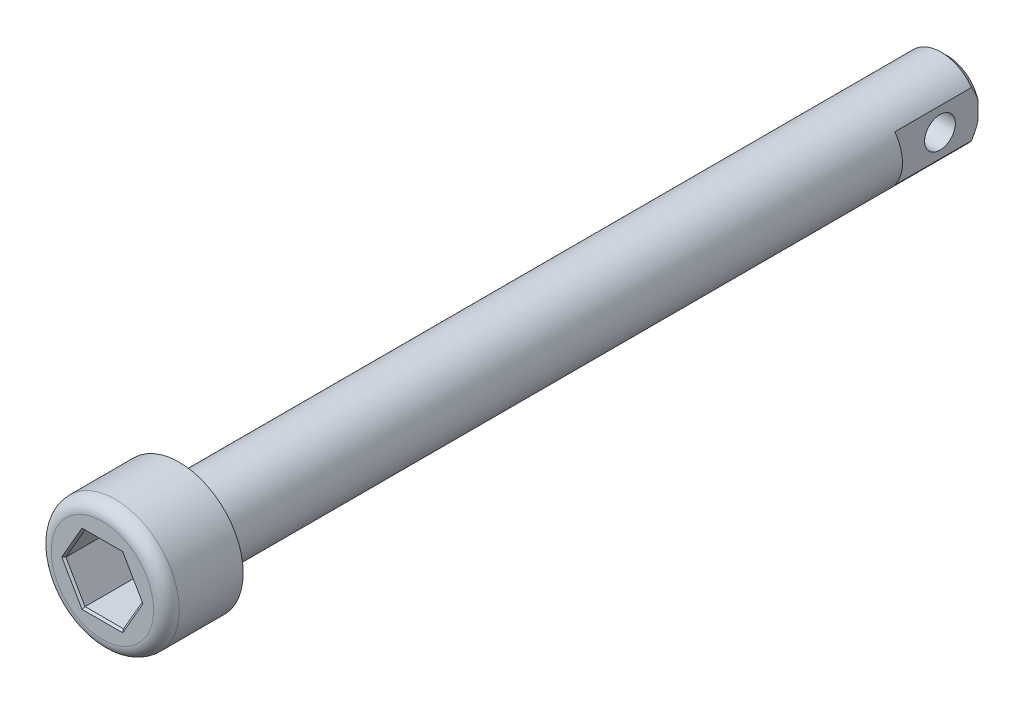
ISO-10303-21;
HEADER;
FILE_DESCRIPTION(('STEP AP214'),'2;1');
FILE_NAME('part.step','',(''),(''),'','','');
FILE_SCHEMA(('AUTOMOTIVE_DESIGN { 1 0 10303 214 1 1 1 1 }'));
ENDSEC;
DATA;
#1=APPLICATION_CONTEXT('core data for automotive mechanical design processes');
#2=APPLICATION_PROTOCOL_DEFINITION('international standard','automotive_design',2000,#1);
#3=PRODUCT_CONTEXT('',#1,'mechanical');
#4=PRODUCT('Part','Part','',(#3));
#5=PRODUCT_RELATED_PRODUCT_CATEGORY('part','',(#4));
#6=PRODUCT_DEFINITION_FORMATION('','',#4);
#7=PRODUCT_DEFINITION_CONTEXT('part definition',#1,'design');
#8=PRODUCT_DEFINITION('design','',#6,#7);
#9=PRODUCT_DEFINITION_SHAPE('','',#8);
#10=(LENGTH_UNIT() NAMED_UNIT(*) SI_UNIT(.MILLI.,.METRE.));
#11=(NAMED_UNIT(*) PLANE_ANGLE_UNIT() SI_UNIT($,.RADIAN.));
#12=(NAMED_UNIT(*) SI_UNIT($,.STERADIAN.) SOLID_ANGLE_UNIT());
#13=UNCERTAINTY_MEASURE_WITH_UNIT(LENGTH_MEASURE(1.E-05),#10,'distance_accuracy_value','');
#14=(GEOMETRIC_REPRESENTATION_CONTEXT(3) GLOBAL_UNCERTAINTY_ASSIGNED_CONTEXT((#13)) GLOBAL_UNIT_ASSIGNED_CONTEXT((#10,
#11,#12)) REPRESENTATION_CONTEXT('',''));
#15=CARTESIAN_POINT('',(0.,0.,0.));
#16=DIRECTION('',(0.,0.,1.));
#17=DIRECTION('',(1.,0.,0.));
#18=AXIS2_PLACEMENT_3D('',#15,#16,#17);
#19=CARTESIAN_POINT('',(0.,0.,-60.));
#20=DIRECTION('',(0.,0.,1.));
#21=DIRECTION('',(1.,0.,0.));
#22=AXIS2_PLACEMENT_3D('',#19,#20,#21);
#23=CONICAL_SURFACE('',#22,2.49999999999999,0.785398163397457);
#24=CARTESIAN_POINT('',(-2.4,-4.86411981016495,-57.0760105524035));
#25=CARTESIAN_POINT('',(-2.4,-4.75343904398375,-57.1752525757856));
#26=CARTESIAN_POINT('',(-2.4,-4.64244060373171,-57.2741434056256));
#27=CARTESIAN_POINT('',(-2.4,-4.41964149150725,-57.471036659869));
#28=CARTESIAN_POINT('',(-2.4,-4.30784074934734,-57.5690390048053));
#29=CARTESIAN_POINT('',(-2.4,-4.08288344036389,-57.7643042597167));
#30=CARTESIAN_POINT('',(-2.4,-3.96972343139539,-57.8615632109516));
#31=CARTESIAN_POINT('',(-2.4,-3.74223523526104,-58.0546982153357));
#32=CARTESIAN_POINT('',(-2.4,-3.6279070948597,-58.1505743234773));
#33=CARTESIAN_POINT('',(-2.4,-3.39101040250221,-58.346179976773));
#34=CARTESIAN_POINT('',(-2.4,-3.26835369634246,-58.4458030535129));
#35=CARTESIAN_POINT('',(-2.4,-3.02097816963856,-58.6424528076332));
#36=CARTESIAN_POINT('',(-2.4,-2.89625945804495,-58.739479621488));
#37=CARTESIAN_POINT('',(-2.4,-2.64434021655384,-58.9298829737348));
#38=CARTESIAN_POINT('',(-2.4,-2.51714357743991,-59.0232646364555));
#39=CARTESIAN_POINT('',(-2.4,-2.25931597512847,-59.205135415471));
#40=CARTESIAN_POINT('',(-2.4,-2.12868602597436,-59.2936259529448));
#41=CARTESIAN_POINT('',(-2.4,-1.89767283106986,-59.4413252876953));
#42=CARTESIAN_POINT('',(-2.4,-1.79831993403233,-59.5021369105638));
#43=CARTESIAN_POINT('',(-2.4,-1.59657013004918,-59.6186387763622));
#44=CARTESIAN_POINT('',(-2.4,-1.4941720670768,-59.6743270406203));
#45=CARTESIAN_POINT('',(-2.4,-1.28681517881027,-59.7782510899381));
#46=CARTESIAN_POINT('',(-2.4,-1.18188921636933,-59.8265516411797));
#47=CARTESIAN_POINT('',(-2.4,-0.96824334152021,-59.9138789881778));
#48=CARTESIAN_POINT('',(-2.4,-0.859526745744453,-59.9529136686686));
#49=CARTESIAN_POINT('',(-2.4,-0.678713978676887,-60.0067783081651));
#50=CARTESIAN_POINT('',(-2.4,-0.607702554186695,-60.0252458479283));
#51=CARTESIAN_POINT('',(-2.4,-0.464445674092847,-60.056471746848));
#52=CARTESIAN_POINT('',(-2.4,-0.392200767680873,-60.0692325813947));
#53=CARTESIAN_POINT('',(-2.4,-0.246990796707283,-60.0883954965483));
#54=CARTESIAN_POINT('',(-2.4,-0.174027217247048,-60.0948086890842));
#55=CARTESIAN_POINT('',(-2.4,-0.0278417356907109,-60.1009482832641));
#56=CARTESIAN_POINT('',(-2.4,0.0453800332330365,-60.1006777369763));
#57=CARTESIAN_POINT('',(-2.4,0.169562357464287,-60.0945613107201));
#58=CARTESIAN_POINT('',(-2.4,0.22061363857575,-60.090411765334));
#59=CARTESIAN_POINT('',(-2.4,0.322299295142589,-60.0789822218707));
#60=CARTESIAN_POINT('',(-2.4,0.372934099273339,-60.0717060066299));
#61=CARTESIAN_POINT('',(-2.4,0.510938341223031,-60.0477310182714));
#62=CARTESIAN_POINT('',(-2.4,0.597797711718896,-60.0280428167905));
#63=CARTESIAN_POINT('',(-2.4,0.769435717051351,-59.981032697809));
#64=CARTESIAN_POINT('',(-2.4,0.854212815150112,-59.9537053163765));
#65=CARTESIAN_POINT('',(-2.4,1.02248534096135,-59.8924616471047));
#66=CARTESIAN_POINT('',(-2.4,1.10595291915121,-59.8584697606695));
#67=CARTESIAN_POINT('',(-2.4,1.27057070813172,-59.78542488708));
#68=CARTESIAN_POINT('',(-2.4,1.35172188385562,-59.7463740459963));
#69=CARTESIAN_POINT('',(-2.4,1.5778510110382,-59.6305367888808));
#70=CARTESIAN_POINT('',(-2.4,1.72044850878499,-59.5491228979087));
#71=CARTESIAN_POINT('',(-2.4,2.00036407753435,-59.3776204493347));
#72=CARTESIAN_POINT('',(-2.4,2.13767732286532,-59.2875242141411));
#73=CARTESIAN_POINT('',(-2.4,2.40882965118527,-59.1010670385392));
#74=CARTESIAN_POINT('',(-2.4,2.54265111223905,-59.0046806560588));
#75=CARTESIAN_POINT('',(-2.4,2.80714311638326,-58.8078094638806));
#76=CARTESIAN_POINT('',(-2.4,2.93781480178323,-58.7073261766787));
#77=CARTESIAN_POINT('',(-2.4,3.18648942016498,-58.5114747109579));
#78=CARTESIAN_POINT('',(-2.4,3.30467335525614,-58.4163353438188));
#79=CARTESIAN_POINT('',(-2.4,3.5394626400626,-58.2241073999028));
#80=CARTESIAN_POINT('',(-2.4,3.65606781755015,-58.1270186132858));
#81=CARTESIAN_POINT('',(-2.4,3.88690049850548,-57.9322671615092));
#82=CARTESIAN_POINT('',(-2.4,4.00114006976861,-57.8346187636832));
#83=CARTESIAN_POINT('',(-2.4,4.22856848808202,-57.6381516856834));
#84=CARTESIAN_POINT('',(-2.4,4.34175754513045,-57.5393332487987));
#85=CARTESIAN_POINT('',(-2.4,4.45454390995784,-57.4400630986402));
#86=B_SPLINE_CURVE_WITH_KNOTS('',3,(#24,#25,#26,#27,#28,#29,#30,#31,#32,#33,#34,#35,#36,#37,#38,
#39,#40,#41,#42,#43,#44,#45,#46,#47,#48,#49,#50,#51,#52,#53,#54,#55,#56,#57,#58,#59,#60,#61,#62,
#63,#64,#65,#66,#67,#68,#69,#70,#71,#72,#73,#74,#75,#76,#77,#78,#79,#80,#81,#82,#83,#84,#85),
.UNSPECIFIED.,.F.,.F.,(4,2,2,2,2,2,2,2,2,2,2,2,2,2,2,2,2,2,2,2,2,2,2,2,2,2,2,2,2,2,4),(0.,
0.445976431845175,0.891992366426557,1.3396221779775,1.78723413896787,2.26125979314327,
2.73526048068079,3.20856888098698,3.68173902458889,4.03108709450083,4.38056952327395,
4.72678680371362,5.07270840806284,5.29263270599269,5.51246151489452,5.73190481600976,
5.95124791220119,6.10481157834378,6.25818997457503,6.52493203717332,6.79186537764818,
7.06202293037782,7.33206625196202,7.82413760975202,8.31664815868377,8.8112917366409,
9.30575314082961,9.76088743256994,10.2160709815332,10.6669202785462,11.1176774206207),.UNSPECIFIED.);
#87=CARTESIAN_POINT('',(-2.4,1.8,-59.5));
#88=VERTEX_POINT('',#87);
#89=CARTESIAN_POINT('',(-2.4,0.699999999999971,-60.));
#90=VERTEX_POINT('',#89);
#91=EDGE_CURVE('E42',#88,#90,#86,.F.);
#92=ORIENTED_EDGE('',*,*,#91,.F.);
#93=CARTESIAN_POINT('',(0.,0.,-59.5));
#94=DIRECTION('',(0.,0.,-1.));
#95=DIRECTION('',(-1.,0.,0.));
#96=AXIS2_PLACEMENT_3D('',#93,#94,#95);
#97=CIRCLE('',#96,3.);
#98=CARTESIAN_POINT('',(2.4,1.80000000000001,-59.5));
#99=VERTEX_POINT('',#98);
#100=EDGE_CURVE('E165',#99,#88,#97,.F.);
#101=ORIENTED_EDGE('',*,*,#100,.F.);
#102=CARTESIAN_POINT('',(2.4,-0.182917150298718,-60.0930395342105));
#103=CARTESIAN_POINT('',(2.4,-0.121580278717381,-60.0977356900018));
#104=CARTESIAN_POINT('',(2.4,-0.0600648739232348,-60.1000460738831));
#105=CARTESIAN_POINT('',(2.4,0.0629060802681704,-60.0999530942566));
#106=CARTESIAN_POINT('',(2.4,0.124361632311835,-60.0975540964579));
#107=CARTESIAN_POINT('',(2.4,0.245776367214991,-60.0881960832197));
#108=CARTESIAN_POINT('',(2.4,0.305742186890069,-60.0813223259073));
#109=CARTESIAN_POINT('',(2.4,0.42504602252914,-60.0633660048119));
#110=CARTESIAN_POINT('',(2.4,0.484383868175235,-60.0522823278433));
#111=CARTESIAN_POINT('',(2.4,0.636834172099958,-60.0186209324715));
#112=CARTESIAN_POINT('',(2.4,0.729305322578463,-59.9931161955343));
#113=CARTESIAN_POINT('',(2.4,0.9116651026255,-59.9341346578621));
#114=CARTESIAN_POINT('',(2.4,1.00155201955853,-59.9006527009611));
#115=CARTESIAN_POINT('',(2.4,1.1805826656807,-59.8266147346972));
#116=CARTESIAN_POINT('',(2.4,1.26966980203561,-59.7859232605085));
#117=CARTESIAN_POINT('',(2.4,1.40137466306025,-59.7210802718688));
#118=CARTESIAN_POINT('',(2.4,1.44494994426732,-59.6988346864155));
#119=CARTESIAN_POINT('',(2.4,1.5315068339098,-59.6532192309917));
#120=CARTESIAN_POINT('',(2.4,1.57448846466409,-59.6298494034371));
#121=CARTESIAN_POINT('',(2.4,1.70696166505809,-59.5558250948151));
#122=CARTESIAN_POINT('',(2.4,1.79551141129556,-59.503482690526));
#123=CARTESIAN_POINT('',(2.4,1.97054493511062,-59.3954370440421));
#124=CARTESIAN_POINT('',(2.4,2.05702820522196,-59.3397329879269));
#125=CARTESIAN_POINT('',(2.4,2.22831495346822,-59.2256601100457));
#126=CARTESIAN_POINT('',(2.4,2.3131169980402,-59.1672891434781));
#127=CARTESIAN_POINT('',(2.4,2.4812533180176,-59.0484653768262));
#128=CARTESIAN_POINT('',(2.4,2.56458747599873,-58.9880124113243));
#129=CARTESIAN_POINT('',(2.4,2.81339890385979,-58.8036916721074));
#130=CARTESIAN_POINT('',(2.4,2.97701703644778,-58.6773167002801));
#131=CARTESIAN_POINT('',(2.4,3.3007354384051,-58.4201409158289));
#132=CARTESIAN_POINT('',(2.4,3.46083523693561,-58.2893395167188));
#133=CARTESIAN_POINT('',(2.4,3.75988517646938,-58.0400956877652));
#134=CARTESIAN_POINT('',(2.4,3.89912085939696,-57.9219948465749));
#135=CARTESIAN_POINT('',(2.4,4.17603868793772,-57.6839537529922));
#136=CARTESIAN_POINT('',(2.4,4.31372062909365,-57.564013263308));
#137=CARTESIAN_POINT('',(2.4,4.5866136511458,-57.3238183160627));
#138=CARTESIAN_POINT('',(2.4,4.72183581744311,-57.2035764279689));
#139=CARTESIAN_POINT('',(2.4,4.99126824847188,-56.9620158560708));
#140=CARTESIAN_POINT('',(2.4,5.12547870443151,-56.8406973857002));
#141=CARTESIAN_POINT('',(2.4,5.2593102872652,-56.7189668139914));
#142=B_SPLINE_CURVE_WITH_KNOTS('',3,(#102,#103,#104,#105,#106,#107,#108,#109,#110,#111,#112,
#113,#114,#115,#116,#117,#118,#119,#120,#121,#122,#123,#124,#125,#126,#127,#128,#129,#130,#131,
#132,#133,#134,#135,#136,#137,#138,#139,#140,#141),.UNSPECIFIED.,.F.,.F.,(4,2,2,2,2,2,2,2,2,2,2,
2,2,2,2,2,2,2,2,4),(0.,0.184497580045827,0.368824207210003,0.549737748873949,0.730699160984812,
1.01799082711515,1.3054686936408,1.59906871572397,1.74583177469035,1.89258930085236,
2.20106970005979,2.50962509029453,2.81843315413889,3.12726581005596,3.74735341849118,
4.36752351055261,4.91523415104331,5.4630160436416,6.00586157259727,6.54860178471588),.UNSPECIFIED.);
#143=CARTESIAN_POINT('',(2.4,0.699999999999971,-60.));
#144=VERTEX_POINT('',#143);
#145=EDGE_CURVE('E155',#144,#99,#142,.T.);
#146=ORIENTED_EDGE('',*,*,#145,.F.);
#147=CARTESIAN_POINT('',(0.,0.,-60.));
#148=DIRECTION('',(0.,0.,-1.));
#149=DIRECTION('',(-1.,0.,0.));
#150=AXIS2_PLACEMENT_3D('',#147,#148,#149);
#151=CIRCLE('',#150,2.49999999999999);
#152=EDGE_CURVE('E56',#90,#144,#151,.T.);
#153=ORIENTED_EDGE('',*,*,#152,.F.);
#154=EDGE_LOOP('',(#92,#101,#146,#153));
#155=FACE_BOUND('',#154,.T.);
#156=ADVANCED_FACE('F33',(#155),#23,.T.);
#157=CARTESIAN_POINT('',(0.,0.,0.));
#158=DIRECTION('',(0.,0.,1.));
#159=DIRECTION('',(1.,0.,0.));
#160=AXIS2_PLACEMENT_3D('',#157,#158,#159);
#161=PLANE('',#160);
#162=CARTESIAN_POINT('',(0.,0.,0.));
#163=DIRECTION('',(0.,0.,1.));
#164=DIRECTION('',(1.,0.,0.));
#165=AXIS2_PLACEMENT_3D('',#162,#163,#164);
#166=CIRCLE('',#165,5.);
#167=CARTESIAN_POINT('',(5.,0.,0.));
#168=VERTEX_POINT('',#167);
#169=EDGE_CURVE('E283',#168,#168,#166,.T.);
#170=ORIENTED_EDGE('',*,*,#169,.F.);
#171=EDGE_LOOP('',(#170));
#172=FACE_BOUND('',#171,.T.);
#173=CARTESIAN_POINT('',(0.,0.,0.));
#174=DIRECTION('',(0.,0.,-1.));
#175=DIRECTION('',(-1.,0.,0.));
#176=AXIS2_PLACEMENT_3D('',#173,#174,#175);
#177=CIRCLE('',#176,3.);
#178=CARTESIAN_POINT('',(-3.,0.,0.));
#179=VERTEX_POINT('',#178);
#180=EDGE_CURVE('E156',#179,#179,#177,.T.);
#181=ORIENTED_EDGE('',*,*,#180,.F.);
#182=EDGE_LOOP('',(#181));
#183=FACE_BOUND('',#182,.T.);
#184=ADVANCED_FACE('F374',(#172,#183),#161,.F.);
#185=CARTESIAN_POINT('',(0.,0.,6.));
#186=DIRECTION('',(0.,0.,1.));
#187=DIRECTION('',(1.,0.,0.));
#188=AXIS2_PLACEMENT_3D('',#185,#186,#187);
#189=PLANE('',#188);
#190=DIRECTION('',(0.499554260265965,0.86628259883835,0.));
#191=VECTOR('',#190,1.);
#192=CARTESIAN_POINT('',(-2.38127901297613,1.3731986275718,6.));
#193=LINE('',#192,#191);
#194=CARTESIAN_POINT('',(-3.1731536570181,0.,6.));
#195=VERTEX_POINT('',#194);
#196=CARTESIAN_POINT('',(-1.58932725627483,2.74653097706382,6.));
#197=VERTEX_POINT('',#196);
#198=EDGE_CURVE('E292',#195,#197,#193,.T.);
#199=ORIENTED_EDGE('',*,*,#198,.T.);
#200=DIRECTION('',(1.,0.,0.));
#201=VECTOR('',#200,1.);
#202=CARTESIAN_POINT('',(0.,2.74653097706382,6.));
#203=LINE('',#202,#201);
#204=CARTESIAN_POINT('',(1.58932725627482,2.74653097706382,6.));
#205=VERTEX_POINT('',#204);
#206=EDGE_CURVE('E302',#197,#205,#203,.T.);
#207=ORIENTED_EDGE('',*,*,#206,.T.);
#208=DIRECTION('',(0.499554260265965,-0.86628259883835,0.));
#209=VECTOR('',#208,1.);
#210=CARTESIAN_POINT('',(2.38127901297613,1.3731986275718,6.));
#211=LINE('',#210,#209);
#212=CARTESIAN_POINT('',(3.1731536570181,0.,6.));
#213=VERTEX_POINT('',#212);
#214=EDGE_CURVE('E300',#205,#213,#211,.T.);
#215=ORIENTED_EDGE('',*,*,#214,.T.);
#216=DIRECTION('',(-0.499554260265965,-0.86628259883835,0.));
#217=VECTOR('',#216,1.);
#218=CARTESIAN_POINT('',(2.38127901297613,-1.3731986275718,6.));
#219=LINE('',#218,#217);
#220=CARTESIAN_POINT('',(1.58932725627483,-2.74653097706382,6.));
#221=VERTEX_POINT('',#220);
#222=EDGE_CURVE('E298',#213,#221,#219,.T.);
#223=ORIENTED_EDGE('',*,*,#222,.T.);
#224=DIRECTION('',(-1.,0.,0.));
#225=VECTOR('',#224,1.);
#226=CARTESIAN_POINT('',(0.,-2.74653097706382,6.));
#227=LINE('',#226,#225);
#228=CARTESIAN_POINT('',(-1.58932725627481,-2.74653097706383,6.));
#229=VERTEX_POINT('',#228);
#230=EDGE_CURVE('E296',#221,#229,#227,.T.);
#231=ORIENTED_EDGE('',*,*,#230,.T.);
#232=DIRECTION('',(-0.499554260265968,0.866282598838348,0.));
#233=VECTOR('',#232,1.);
#234=CARTESIAN_POINT('',(-2.38127901297612,-1.37319862757181,6.));
#235=LINE('',#234,#233);
#236=EDGE_CURVE('E294',#229,#195,#235,.T.);
#237=ORIENTED_EDGE('',*,*,#236,.T.);
#238=EDGE_LOOP('',(#199,#207,#215,#223,#231,#237));
#239=FACE_BOUND('',#238,.T.);
#240=CARTESIAN_POINT('',(0.,0.,6.));
#241=DIRECTION('',(0.,0.,1.));
#242=DIRECTION('',(1.,0.,0.));
#243=AXIS2_PLACEMENT_3D('',#240,#241,#242);
#244=CIRCLE('',#243,4.);
#245=CARTESIAN_POINT('',(4.,0.,6.));
#246=VERTEX_POINT('',#245);
#247=EDGE_CURVE('E286',#246,#246,#244,.T.);
#248=ORIENTED_EDGE('',*,*,#247,.T.);
#249=EDGE_LOOP('',(#248));
#250=FACE_BOUND('',#249,.T.);
#251=ADVANCED_FACE('F333',(#239,#250),#189,.T.);
#252=CARTESIAN_POINT('',(0.,0.,6.));
#253=DIRECTION('',(0.,0.,-1.));
#254=DIRECTION('',(-1.,0.,0.));
#255=AXIS2_PLACEMENT_3D('',#252,#253,#254);
#256=CYLINDRICAL_SURFACE('',#255,5.);
#257=CARTESIAN_POINT('',(0.,0.,5.));
#258=DIRECTION('',(0.,0.,1.));
#259=DIRECTION('',(1.,0.,0.));
#260=AXIS2_PLACEMENT_3D('',#257,#258,#259);
#261=CIRCLE('',#260,5.);
#262=CARTESIAN_POINT('',(5.,0.,5.));
#263=VERTEX_POINT('',#262);
#264=EDGE_CURVE('E289',#263,#263,#261,.F.);
#265=ORIENTED_EDGE('',*,*,#264,.T.);
#266=EDGE_LOOP('',(#265));
#267=FACE_BOUND('',#266,.T.);
#268=ORIENTED_EDGE('',*,*,#169,.T.);
#269=EDGE_LOOP('',(#268));
#270=FACE_BOUND('',#269,.T.);
#271=ADVANCED_FACE('F35',(#267,#270),#256,.T.);
#272=CARTESIAN_POINT('',(-1.50267324630073,-2.59653097706383,2.));
#273=DIRECTION('',(0.866282598838348,0.499554260265968,0.));
#274=DIRECTION('',(-0.499554260265968,0.866282598838348,0.));
#275=AXIS2_PLACEMENT_3D('',#272,#273,#274);
#276=PLANE('',#275);
#277=DIRECTION('',(0.,0.,1.));
#278=VECTOR('',#277,1.);
#279=CARTESIAN_POINT('',(-3.,0.,2.));
#280=LINE('',#279,#278);
#281=CARTESIAN_POINT('',(-3.,0.,2.));
#282=VERTEX_POINT('',#281);
#283=CARTESIAN_POINT('',(-3.,0.,5.85));
#284=VERTEX_POINT('',#283);
#285=EDGE_CURVE('E280',#282,#284,#280,.T.);
#286=ORIENTED_EDGE('',*,*,#285,.T.);
#287=DIRECTION('',(0.499554260265968,-0.866282598838348,0.));
#288=VECTOR('',#287,1.);
#289=CARTESIAN_POINT('',(-1.50267324630073,-2.59653097706383,5.85));
#290=LINE('',#289,#288);
#291=CARTESIAN_POINT('',(-1.50267324630073,-2.59653097706383,5.85));
#292=VERTEX_POINT('',#291);
#293=EDGE_CURVE('E313',#284,#292,#290,.T.);
#294=ORIENTED_EDGE('',*,*,#293,.T.);
#295=DIRECTION('',(0.,0.,1.));
#296=VECTOR('',#295,1.);
#297=CARTESIAN_POINT('',(-1.50267324630073,-2.59653097706383,2.));
#298=LINE('',#297,#296);
#299=CARTESIAN_POINT('',(-1.50267324630073,-2.59653097706383,2.));
#300=VERTEX_POINT('',#299);
#301=EDGE_CURVE('E265',#300,#292,#298,.T.);
#302=ORIENTED_EDGE('',*,*,#301,.F.);
#303=DIRECTION('',(-0.499554260265968,0.866282598838348,0.));
#304=VECTOR('',#303,1.);
#305=CARTESIAN_POINT('',(-1.50267324630073,-2.59653097706383,2.));
#306=LINE('',#305,#304);
#307=EDGE_CURVE('E247',#300,#282,#306,.T.);
#308=ORIENTED_EDGE('',*,*,#307,.T.);
#309=EDGE_LOOP('',(#286,#294,#302,#308));
#310=FACE_BOUND('',#309,.T.);
#311=ADVANCED_FACE('F321',(#310),#276,.T.);
#312=CARTESIAN_POINT('',(-3.,0.,2.));
#313=DIRECTION('',(0.86628259883835,-0.499554260265965,0.));
#314=DIRECTION('',(0.499554260265965,0.86628259883835,0.));
#315=AXIS2_PLACEMENT_3D('',#312,#313,#314);
#316=PLANE('',#315);
#317=DIRECTION('',(0.,0.,1.));
#318=VECTOR('',#317,1.);
#319=CARTESIAN_POINT('',(-1.50267324630075,2.59653097706382,2.));
#320=LINE('',#319,#318);
#321=CARTESIAN_POINT('',(-1.50267324630075,2.59653097706382,2.));
#322=VERTEX_POINT('',#321);
#323=CARTESIAN_POINT('',(-1.50267324630075,2.59653097706382,5.85));
#324=VERTEX_POINT('',#323);
#325=EDGE_CURVE('E277',#322,#324,#320,.T.);
#326=ORIENTED_EDGE('',*,*,#325,.T.);
#327=DIRECTION('',(-0.499554260265965,-0.86628259883835,0.));
#328=VECTOR('',#327,1.);
#329=CARTESIAN_POINT('',(-3.,0.,5.85));
#330=LINE('',#329,#328);
#331=EDGE_CURVE('E160',#324,#284,#330,.T.);
#332=ORIENTED_EDGE('',*,*,#331,.T.);
#333=ORIENTED_EDGE('',*,*,#285,.F.);
#334=DIRECTION('',(0.499554260265965,0.86628259883835,0.));
#335=VECTOR('',#334,1.);
#336=CARTESIAN_POINT('',(-3.,0.,2.));
#337=LINE('',#336,#335);
#338=EDGE_CURVE('E250',#282,#322,#337,.T.);
#339=ORIENTED_EDGE('',*,*,#338,.T.);
#340=EDGE_LOOP('',(#326,#332,#333,#339));
#341=FACE_BOUND('',#340,.T.);
#342=ADVANCED_FACE('F318',(#341),#316,.T.);
#343=CARTESIAN_POINT('',(-1.50267324630075,2.59653097706382,2.));
#344=DIRECTION('',(0.,-1.,0.));
#345=DIRECTION('',(0.,0.,-1.));
#346=AXIS2_PLACEMENT_3D('',#343,#344,#345);
#347=PLANE('',#346);
#348=DIRECTION('',(0.,0.,1.));
#349=VECTOR('',#348,1.);
#350=CARTESIAN_POINT('',(1.50267324630075,2.59653097706382,2.));
#351=LINE('',#350,#349);
#352=CARTESIAN_POINT('',(1.50267324630075,2.59653097706382,2.));
#353=VERTEX_POINT('',#352);
#354=CARTESIAN_POINT('',(1.50267324630075,2.59653097706382,5.85));
#355=VERTEX_POINT('',#354);
#356=EDGE_CURVE('E274',#353,#355,#351,.T.);
#357=ORIENTED_EDGE('',*,*,#356,.T.);
#358=DIRECTION('',(-1.,0.,0.));
#359=VECTOR('',#358,1.);
#360=CARTESIAN_POINT('',(-1.50267324630075,2.59653097706382,5.85));
#361=LINE('',#360,#359);
#362=EDGE_CURVE('E305',#355,#324,#361,.T.);
#363=ORIENTED_EDGE('',*,*,#362,.T.);
#364=ORIENTED_EDGE('',*,*,#325,.F.);
#365=DIRECTION('',(1.,0.,0.));
#366=VECTOR('',#365,1.);
#367=CARTESIAN_POINT('',(-1.50267324630075,2.59653097706382,2.));
#368=LINE('',#367,#366);
#369=EDGE_CURVE('E253',#322,#353,#368,.T.);
#370=ORIENTED_EDGE('',*,*,#369,.T.);
#371=EDGE_LOOP('',(#357,#363,#364,#370));
#372=FACE_BOUND('',#371,.T.);
#373=ADVANCED_FACE('F353',(#372),#347,.T.);
#374=CARTESIAN_POINT('',(1.50267324630075,2.59653097706382,2.));
#375=DIRECTION('',(-0.86628259883835,-0.499554260265965,0.));
#376=DIRECTION('',(0.499554260265965,-0.86628259883835,0.));
#377=AXIS2_PLACEMENT_3D('',#374,#375,#376);
#378=PLANE('',#377);
#379=DIRECTION('',(0.,0.,1.));
#380=VECTOR('',#379,1.);
#381=CARTESIAN_POINT('',(3.,0.,2.));
#382=LINE('',#381,#380);
#383=CARTESIAN_POINT('',(3.,0.,2.));
#384=VERTEX_POINT('',#383);
#385=CARTESIAN_POINT('',(3.,0.,5.85));
#386=VERTEX_POINT('',#385);
#387=EDGE_CURVE('E271',#384,#386,#382,.T.);
#388=ORIENTED_EDGE('',*,*,#387,.T.);
#389=DIRECTION('',(-0.499554260265965,0.86628259883835,0.));
#390=VECTOR('',#389,1.);
#391=CARTESIAN_POINT('',(1.50267324630075,2.59653097706382,5.85));
#392=LINE('',#391,#390);
#393=EDGE_CURVE('E308',#386,#355,#392,.T.);
#394=ORIENTED_EDGE('',*,*,#393,.T.);
#395=ORIENTED_EDGE('',*,*,#356,.F.);
#396=DIRECTION('',(0.499554260265965,-0.86628259883835,0.));
#397=VECTOR('',#396,1.);
#398=CARTESIAN_POINT('',(1.50267324630075,2.59653097706382,2.));
#399=LINE('',#398,#397);
#400=EDGE_CURVE('E256',#353,#384,#399,.T.);
#401=ORIENTED_EDGE('',*,*,#400,.T.);
#402=EDGE_LOOP('',(#388,#394,#395,#401));
#403=FACE_BOUND('',#402,.T.);
#404=ADVANCED_FACE('F505',(#403),#378,.T.);
#405=CARTESIAN_POINT('',(3.,0.,2.));
#406=DIRECTION('',(-0.86628259883835,0.499554260265965,0.));
#407=DIRECTION('',(-0.499554260265965,-0.86628259883835,0.));
#408=AXIS2_PLACEMENT_3D('',#405,#406,#407);
#409=PLANE('',#408);
#410=DIRECTION('',(0.,0.,1.));
#411=VECTOR('',#410,1.);
#412=CARTESIAN_POINT('',(1.50267324630075,-2.59653097706382,2.));
#413=LINE('',#412,#411);
#414=CARTESIAN_POINT('',(1.50267324630075,-2.59653097706382,2.));
#415=VERTEX_POINT('',#414);
#416=CARTESIAN_POINT('',(1.50267324630075,-2.59653097706382,5.85));
#417=VERTEX_POINT('',#416);
#418=EDGE_CURVE('E268',#415,#417,#413,.T.);
#419=ORIENTED_EDGE('',*,*,#418,.T.);
#420=DIRECTION('',(0.499554260265965,0.86628259883835,0.));
#421=VECTOR('',#420,1.);
#422=CARTESIAN_POINT('',(3.,0.,5.85));
#423=LINE('',#422,#421);
#424=EDGE_CURVE('E310',#417,#386,#423,.T.);
#425=ORIENTED_EDGE('',*,*,#424,.T.);
#426=ORIENTED_EDGE('',*,*,#387,.F.);
#427=DIRECTION('',(-0.499554260265965,-0.86628259883835,0.));
#428=VECTOR('',#427,1.);
#429=CARTESIAN_POINT('',(3.,0.,2.));
#430=LINE('',#429,#428);
#431=EDGE_CURVE('E259',#384,#415,#430,.T.);
#432=ORIENTED_EDGE('',*,*,#431,.T.);
#433=EDGE_LOOP('',(#419,#425,#426,#432));
#434=FACE_BOUND('',#433,.T.);
#435=ADVANCED_FACE('F345',(#434),#409,.T.);
#436=CARTESIAN_POINT('',(1.50267324630075,-2.59653097706382,2.));
#437=DIRECTION('',(0.,1.,0.));
#438=DIRECTION('',(-1.,0.,0.));
#439=AXIS2_PLACEMENT_3D('',#436,#437,#438);
#440=PLANE('',#439);
#441=ORIENTED_EDGE('',*,*,#301,.T.);
#442=DIRECTION('',(1.,0.,0.));
#443=VECTOR('',#442,1.);
#444=CARTESIAN_POINT('',(1.50267324630075,-2.59653097706382,5.85));
#445=LINE('',#444,#443);
#446=EDGE_CURVE('E312',#292,#417,#445,.T.);
#447=ORIENTED_EDGE('',*,*,#446,.T.);
#448=ORIENTED_EDGE('',*,*,#418,.F.);
#449=DIRECTION('',(-1.,0.,0.));
#450=VECTOR('',#449,1.);
#451=CARTESIAN_POINT('',(1.50267324630075,-2.59653097706382,2.));
#452=LINE('',#451,#450);
#453=EDGE_CURVE('E262',#415,#300,#452,.T.);
#454=ORIENTED_EDGE('',*,*,#453,.T.);
#455=EDGE_LOOP('',(#441,#447,#448,#454));
#456=FACE_BOUND('',#455,.T.);
#457=ADVANCED_FACE('F343',(#456),#440,.T.);
#458=CARTESIAN_POINT('',(-1.50267324630073,-2.59653097706383,2.));
#459=DIRECTION('',(0.,0.,1.));
#460=DIRECTION('',(1.,0.,0.));
#461=AXIS2_PLACEMENT_3D('',#458,#459,#460);
#462=PLANE('',#461);
#463=ORIENTED_EDGE('',*,*,#307,.F.);
#464=ORIENTED_EDGE('',*,*,#453,.F.);
#465=ORIENTED_EDGE('',*,*,#431,.F.);
#466=ORIENTED_EDGE('',*,*,#400,.F.);
#467=ORIENTED_EDGE('',*,*,#369,.F.);
#468=ORIENTED_EDGE('',*,*,#338,.F.);
#469=EDGE_LOOP('',(#463,#464,#465,#466,#467,#468));
#470=FACE_BOUND('',#469,.T.);
#471=ADVANCED_FACE('F350',(#470),#462,.T.);
#472=CARTESIAN_POINT('',(0.,0.,5.));
#473=DIRECTION('',(0.,0.,1.));
#474=DIRECTION('',(1.,0.,0.));
#475=AXIS2_PLACEMENT_3D('',#472,#473,#474);
#476=TOROIDAL_SURFACE('',#475,4.,1.);
#477=ORIENTED_EDGE('',*,*,#264,.F.);
#478=EDGE_LOOP('',(#477));
#479=FACE_BOUND('',#478,.T.);
#480=ORIENTED_EDGE('',*,*,#247,.F.);
#481=EDGE_LOOP('',(#480));
#482=FACE_BOUND('',#481,.T.);
#483=ADVANCED_FACE('F532',(#479,#482),#476,.T.);
#484=CARTESIAN_POINT('',(0.,-2.74653097706382,6.));
#485=DIRECTION('',(0.,-0.707106781186544,-0.707106781186552));
#486=DIRECTION('',(0.,0.707106781186552,-0.707106781186544));
#487=AXIS2_PLACEMENT_3D('',#484,#485,#486);
#488=PLANE('',#487);
#489=DIRECTION('',(-0.378156989970926,0.654598079334234,-0.654598079334228));
#490=VECTOR('',#489,1.);
#491=CARTESIAN_POINT('',(1.36262266046999,-2.35410032808521,5.6075693510214));
#492=LINE('',#491,#490);
#493=EDGE_CURVE('E241',#417,#221,#492,.F.);
#494=ORIENTED_EDGE('',*,*,#493,.F.);
#495=ORIENTED_EDGE('',*,*,#446,.F.);
#496=DIRECTION('',(0.378156989970926,0.654598079334236,-0.654598079334227));
#497=VECTOR('',#496,1.);
#498=CARTESIAN_POINT('',(-1.36204915303846,-2.35310757408857,5.60657659702475));
#499=LINE('',#498,#497);
#500=EDGE_CURVE('E244',#229,#292,#499,.T.);
#501=ORIENTED_EDGE('',*,*,#500,.F.);
#502=ORIENTED_EDGE('',*,*,#230,.F.);
#503=EDGE_LOOP('',(#494,#495,#501,#502));
#504=FACE_BOUND('',#503,.T.);
#505=ADVANCED_FACE('F340',(#504),#488,.F.);
#506=CARTESIAN_POINT('',(-2.38127901297612,-1.37319862757181,6.));
#507=DIRECTION('',(-0.612554300062496,-0.353238205004692,-0.707106781186554));
#508=DIRECTION('',(-0.75583273656706,0.,0.654764747320402));
#509=AXIS2_PLACEMENT_3D('',#506,#507,#508);
#510=PLANE('',#509);
#511=ORIENTED_EDGE('',*,*,#500,.T.);
#512=ORIENTED_EDGE('',*,*,#293,.F.);
#513=DIRECTION('',(0.755832736567059,0.,-0.654764747320403));
#514=VECTOR('',#513,1.);
#515=CARTESIAN_POINT('',(-2.7207690352338,0.,5.6081070741662));
#516=LINE('',#515,#514);
#517=EDGE_CURVE('E238',#195,#284,#516,.T.);
#518=ORIENTED_EDGE('',*,*,#517,.F.);
#519=ORIENTED_EDGE('',*,*,#236,.F.);
#520=EDGE_LOOP('',(#511,#512,#518,#519));
#521=FACE_BOUND('',#520,.T.);
#522=ADVANCED_FACE('F326',(#521),#510,.F.);
#523=CARTESIAN_POINT('',(2.38127901297613,-1.3731986275718,6.));
#524=DIRECTION('',(0.612554300062499,-0.353238205004691,-0.707106781186552));
#525=DIRECTION('',(-0.755832736567058,0.,-0.654764747320404));
#526=AXIS2_PLACEMENT_3D('',#523,#524,#525);
#527=PLANE('',#526);
#528=ORIENTED_EDGE('',*,*,#493,.T.);
#529=ORIENTED_EDGE('',*,*,#222,.F.);
#530=DIRECTION('',(-0.755832736567057,0.,-0.654764747320405));
#531=VECTOR('',#530,1.);
#532=CARTESIAN_POINT('',(2.7207690352338,0.,5.6081070741662));
#533=LINE('',#532,#531);
#534=EDGE_CURVE('E235',#386,#213,#533,.F.);
#535=ORIENTED_EDGE('',*,*,#534,.F.);
#536=ORIENTED_EDGE('',*,*,#424,.F.);
#537=EDGE_LOOP('',(#528,#529,#535,#536));
#538=FACE_BOUND('',#537,.T.);
#539=ADVANCED_FACE('F364',(#538),#527,.F.);
#540=CARTESIAN_POINT('',(-2.38127901297613,1.3731986275718,6.));
#541=DIRECTION('',(-0.612554300062499,0.353238205004691,-0.707106781186552));
#542=DIRECTION('',(-0.755832736567058,0.,0.654764747320404));
#543=AXIS2_PLACEMENT_3D('',#540,#541,#542);
#544=PLANE('',#543);
#545=ORIENTED_EDGE('',*,*,#517,.T.);
#546=ORIENTED_EDGE('',*,*,#331,.F.);
#547=DIRECTION('',(-0.378156989970925,0.654598079334235,0.654598079334228));
#548=VECTOR('',#547,1.);
#549=CARTESIAN_POINT('',(-1.36204915303848,2.35310757408856,5.60657659702475));
#550=LINE('',#549,#548);
#551=EDGE_CURVE('E233',#197,#324,#550,.F.);
#552=ORIENTED_EDGE('',*,*,#551,.F.);
#553=ORIENTED_EDGE('',*,*,#198,.F.);
#554=EDGE_LOOP('',(#545,#546,#552,#553));
#555=FACE_BOUND('',#554,.T.);
#556=ADVANCED_FACE('F330',(#555),#544,.F.);
#557=CARTESIAN_POINT('',(2.38127901297613,1.3731986275718,6.));
#558=DIRECTION('',(0.6125543000625,0.353238205004691,-0.707106781186551));
#559=DIRECTION('',(-0.755832736567057,0.,-0.654764747320405));
#560=AXIS2_PLACEMENT_3D('',#557,#558,#559);
#561=PLANE('',#560);
#562=ORIENTED_EDGE('',*,*,#534,.T.);
#563=ORIENTED_EDGE('',*,*,#214,.F.);
#564=DIRECTION('',(-0.378156989970923,-0.654598079334236,-0.654598079334228));
#565=VECTOR('',#564,1.);
#566=CARTESIAN_POINT('',(1.36204915303848,2.35310757408856,5.60657659702475));
#567=LINE('',#566,#565);
#568=EDGE_CURVE('E230',#355,#205,#567,.F.);
#569=ORIENTED_EDGE('',*,*,#568,.F.);
#570=ORIENTED_EDGE('',*,*,#393,.F.);
#571=EDGE_LOOP('',(#562,#563,#569,#570));
#572=FACE_BOUND('',#571,.T.);
#573=ADVANCED_FACE('F361',(#572),#561,.F.);
#574=CARTESIAN_POINT('',(0.,2.74653097706382,6.));
#575=DIRECTION('',(0.,0.707106781186544,-0.707106781186552));
#576=DIRECTION('',(0.,0.707106781186552,0.707106781186544));
#577=AXIS2_PLACEMENT_3D('',#574,#575,#576);
#578=PLANE('',#577);
#579=ORIENTED_EDGE('',*,*,#551,.T.);
#580=ORIENTED_EDGE('',*,*,#362,.F.);
#581=ORIENTED_EDGE('',*,*,#568,.T.);
#582=ORIENTED_EDGE('',*,*,#206,.F.);
#583=EDGE_LOOP('',(#579,#580,#581,#582));
#584=FACE_BOUND('',#583,.T.);
#585=ADVANCED_FACE('F357',(#584),#578,.F.);
#586=CARTESIAN_POINT('',(0.,0.,-60.));
#587=DIRECTION('',(0.,0.,1.));
#588=DIRECTION('',(1.,0.,0.));
#589=AXIS2_PLACEMENT_3D('',#586,#587,#588);
#590=CYLINDRICAL_SURFACE('',#589,3.);
#591=ORIENTED_EDGE('',*,*,#100,.T.);
#592=DIRECTION('',(0.,0.,1.));
#593=VECTOR('',#592,1.);
#594=CARTESIAN_POINT('',(-2.4,1.8,-60.));
#595=LINE('',#594,#593);
#596=CARTESIAN_POINT('',(-2.4,1.8,-53.5));
#597=VERTEX_POINT('',#596);
#598=EDGE_CURVE('E142',#88,#597,#595,.T.);
#599=ORIENTED_EDGE('',*,*,#598,.T.);
#600=CARTESIAN_POINT('',(0.,0.,-53.5));
#601=DIRECTION('',(0.,0.,-1.));
#602=DIRECTION('',(-1.,0.,0.));
#603=AXIS2_PLACEMENT_3D('',#600,#601,#602);
#604=CIRCLE('',#603,3.);
#605=CARTESIAN_POINT('',(-2.4,-1.8,-53.5));
#606=VERTEX_POINT('',#605);
#607=EDGE_CURVE('E11',#606,#597,#604,.T.);
#608=ORIENTED_EDGE('',*,*,#607,.F.);
#609=DIRECTION('',(0.,0.,1.));
#610=VECTOR('',#609,1.);
#611=CARTESIAN_POINT('',(-2.4,-1.8,-60.));
#612=LINE('',#611,#610);
#613=CARTESIAN_POINT('',(-2.4,-1.80000000000002,-59.5));
#614=VERTEX_POINT('',#613);
#615=EDGE_CURVE('E217',#606,#614,#612,.F.);
#616=ORIENTED_EDGE('',*,*,#615,.T.);
#617=CARTESIAN_POINT('',(2.4,-1.8,-59.5));
#618=VERTEX_POINT('',#617);
#619=EDGE_CURVE('E158',#614,#618,#97,.F.);
#620=ORIENTED_EDGE('',*,*,#619,.T.);
#621=DIRECTION('',(0.,0.,1.));
#622=VECTOR('',#621,1.);
#623=CARTESIAN_POINT('',(2.4,-1.8,-60.));
#624=LINE('',#623,#622);
#625=CARTESIAN_POINT('',(2.4,-1.8,-53.5));
#626=VERTEX_POINT('',#625);
#627=EDGE_CURVE('E211',#618,#626,#624,.T.);
#628=ORIENTED_EDGE('',*,*,#627,.T.);
#629=CARTESIAN_POINT('',(0.,0.,-53.5));
#630=DIRECTION('',(0.,0.,1.));
#631=DIRECTION('',(1.,0.,0.));
#632=AXIS2_PLACEMENT_3D('',#629,#630,#631);
#633=CIRCLE('',#632,3.);
#634=CARTESIAN_POINT('',(2.4,1.8,-53.5));
#635=VERTEX_POINT('',#634);
#636=EDGE_CURVE('E201',#626,#635,#633,.T.);
#637=ORIENTED_EDGE('',*,*,#636,.T.);
#638=DIRECTION('',(0.,0.,1.));
#639=VECTOR('',#638,1.);
#640=CARTESIAN_POINT('',(2.4,1.8,-60.));
#641=LINE('',#640,#639);
#642=EDGE_CURVE('E228',#635,#99,#641,.F.);
#643=ORIENTED_EDGE('',*,*,#642,.T.);
#644=EDGE_LOOP('',(#591,#599,#608,#616,#620,#628,#637,#643));
#645=FACE_BOUND('',#644,.T.);
#646=ORIENTED_EDGE('',*,*,#180,.T.);
#647=EDGE_LOOP('',(#646));
#648=FACE_BOUND('',#647,.T.);
#649=ADVANCED_FACE('F220',(#645,#648),#590,.T.);
#650=CARTESIAN_POINT('',(0.,0.,-60.));
#651=DIRECTION('',(0.,0.,-1.));
#652=DIRECTION('',(-1.,0.,0.));
#653=AXIS2_PLACEMENT_3D('',#650,#651,#652);
#654=PLANE('',#653);
#655=DIRECTION('',(0.,-1.,0.));
#656=VECTOR('',#655,1.);
#657=CARTESIAN_POINT('',(-2.4,3.,-60.));
#658=LINE('',#657,#656);
#659=CARTESIAN_POINT('',(-2.4,-0.699999999999972,-60.));
#660=VERTEX_POINT('',#659);
#661=EDGE_CURVE('E49',#90,#660,#658,.T.);
#662=ORIENTED_EDGE('',*,*,#661,.F.);
#663=ORIENTED_EDGE('',*,*,#152,.T.);
#664=DIRECTION('',(0.,1.,0.));
#665=VECTOR('',#664,1.);
#666=CARTESIAN_POINT('',(2.4,-2.74653097706382,-60.));
#667=LINE('',#666,#665);
#668=CARTESIAN_POINT('',(2.4,-0.699999999999971,-60.));
#669=VERTEX_POINT('',#668);
#670=EDGE_CURVE('E209',#669,#144,#667,.T.);
#671=ORIENTED_EDGE('',*,*,#670,.F.);
#672=EDGE_CURVE('E151',#669,#660,#151,.T.);
#673=ORIENTED_EDGE('',*,*,#672,.T.);
#674=EDGE_LOOP('',(#662,#663,#671,#673));
#675=FACE_BOUND('',#674,.T.);
#676=ADVANCED_FACE('F149',(#675),#654,.T.);
#677=EDGE_CURVE('E146',#660,#614,#86,.F.);
#678=ORIENTED_EDGE('',*,*,#677,.F.);
#679=ORIENTED_EDGE('',*,*,#672,.F.);
#680=CARTESIAN_POINT('',(2.4,-4.65685555848191,-57.2610780028174));
#681=CARTESIAN_POINT('',(2.4,-4.54447538261443,-57.3609541052331));
#682=CARTESIAN_POINT('',(2.4,-4.43173353441488,-57.4604276656663));
#683=CARTESIAN_POINT('',(2.4,-4.20532199482171,-57.6583412271307));
#684=CARTESIAN_POINT('',(2.4,-4.09165218902542,-57.7567810971964));
#685=CARTESIAN_POINT('',(2.4,-3.86274978907238,-57.9527662308612));
#686=CARTESIAN_POINT('',(2.4,-3.74751275332289,-58.0503063173486));
#687=CARTESIAN_POINT('',(2.4,-3.51566609475143,-58.2437321057837));
#688=CARTESIAN_POINT('',(2.4,-3.39905654761405,-58.3396178982421));
#689=CARTESIAN_POINT('',(2.4,-3.16671098494565,-58.5271600431762));
#690=CARTESIAN_POINT('',(2.4,-3.05101272025331,-58.6188630344319));
#691=CARTESIAN_POINT('',(2.4,-2.817541199562,-58.7995853362404));
#692=CARTESIAN_POINT('',(2.4,-2.69976807595524,-58.8886048170466));
#693=CARTESIAN_POINT('',(2.4,-2.46171144250576,-59.0629293339664));
#694=CARTESIAN_POINT('',(2.4,-2.34143116518047,-59.148238762396));
#695=CARTESIAN_POINT('',(2.4,-2.09749849484987,-59.3138642877116));
#696=CARTESIAN_POINT('',(2.4,-1.97384722503552,-59.3941820192364));
#697=CARTESIAN_POINT('',(2.4,-1.75791299820789,-59.5259152118819));
#698=CARTESIAN_POINT('',(2.4,-1.66669241347732,-59.5790617758898));
#699=CARTESIAN_POINT('',(2.4,-1.48168578377438,-59.6805301142302));
#700=CARTESIAN_POINT('',(2.4,-1.38790194716163,-59.7288558847359));
#701=CARTESIAN_POINT('',(2.4,-1.19659520658974,-59.819573237358));
#702=CARTESIAN_POINT('',(2.4,-1.09904991437724,-59.8619186697516));
#703=CARTESIAN_POINT('',(2.4,-0.900439135985966,-59.9382778018488));
#704=CARTESIAN_POINT('',(2.4,-0.799363814268618,-59.972265677165));
#705=CARTESIAN_POINT('',(2.4,-0.696602722330561,-60.0009491096101));
#706=B_SPLINE_CURVE_WITH_KNOTS('',3,(#680,#681,#682,#683,#684,#685,#686,#687,#688,#689,#690,
#691,#692,#693,#694,#695,#696,#697,#698,#699,#700,#701,#702,#703,#704,#705),.UNSPECIFIED.,.F.,
.F.,(4,2,2,2,2,2,2,2,2,2,2,2,4),(0.,0.451047602399127,0.902151677925053,1.35506650633236,
1.80795647552287,2.25082672642873,2.69366882037043,3.13597150925308,3.57812858499354,
3.89473858150917,4.21108390591171,4.52975069073773,4.84939010238877),.UNSPECIFIED.);
#707=EDGE_CURVE('E173',#618,#669,#706,.T.);
#708=ORIENTED_EDGE('',*,*,#707,.F.);
#709=ORIENTED_EDGE('',*,*,#619,.F.);
#710=EDGE_LOOP('',(#678,#679,#708,#709));
#711=FACE_BOUND('',#710,.T.);
#712=ADVANCED_FACE('F178',(#711),#23,.T.);
#713=CARTESIAN_POINT('',(4.12579597141001,-2.74653097706382,-53.5));
#714=DIRECTION('',(0.,0.,1.));
#715=DIRECTION('',(1.,0.,0.));
#716=AXIS2_PLACEMENT_3D('',#713,#714,#715);
#717=PLANE('',#716);
#718=DIRECTION('',(0.,1.,0.));
#719=VECTOR('',#718,1.);
#720=CARTESIAN_POINT('',(2.4,-2.74653097706382,-53.5));
#721=LINE('',#720,#719);
#722=EDGE_CURVE('E214',#626,#635,#721,.T.);
#723=ORIENTED_EDGE('',*,*,#722,.T.);
#724=ORIENTED_EDGE('',*,*,#636,.F.);
#725=EDGE_LOOP('',(#723,#724));
#726=FACE_BOUND('',#725,.T.);
#727=ADVANCED_FACE('F186',(#726),#717,.F.);
#728=CARTESIAN_POINT('',(2.4,-2.74653097706382,-53.5));
#729=DIRECTION('',(-1.,0.,0.));
#730=DIRECTION('',(0.,0.,1.));
#731=AXIS2_PLACEMENT_3D('',#728,#729,#730);
#732=PLANE('',#731);
#733=CARTESIAN_POINT('',(2.4,0.,-57.0304113833063));
#734=DIRECTION('',(1.,0.,0.));
#735=DIRECTION('',(0.,0.,-1.));
#736=AXIS2_PLACEMENT_3D('',#733,#734,#735);
#737=CIRCLE('',#736,1.2);
#738=CARTESIAN_POINT('',(2.4,0.,-58.2304113833063));
#739=VERTEX_POINT('',#738);
#740=EDGE_CURVE('E457',#739,#739,#737,.T.);
#741=ORIENTED_EDGE('',*,*,#740,.F.);
#742=EDGE_LOOP('',(#741));
#743=FACE_BOUND('',#742,.T.);
#744=ORIENTED_EDGE('',*,*,#707,.T.);
#745=ORIENTED_EDGE('',*,*,#670,.T.);
#746=ORIENTED_EDGE('',*,*,#145,.T.);
#747=ORIENTED_EDGE('',*,*,#642,.F.);
#748=ORIENTED_EDGE('',*,*,#722,.F.);
#749=ORIENTED_EDGE('',*,*,#627,.F.);
#750=EDGE_LOOP('',(#744,#745,#746,#747,#748,#749));
#751=FACE_BOUND('',#750,.T.);
#752=ADVANCED_FACE('F181',(#743,#751),#732,.F.);
#753=CARTESIAN_POINT('',(-4.,-3.,-53.5));
#754=DIRECTION('',(0.,0.,-1.));
#755=DIRECTION('',(-1.,0.,0.));
#756=AXIS2_PLACEMENT_3D('',#753,#754,#755);
#757=PLANE('',#756);
#758=ORIENTED_EDGE('',*,*,#607,.T.);
#759=DIRECTION('',(0.,-1.,0.));
#760=VECTOR('',#759,1.);
#761=CARTESIAN_POINT('',(-2.4,3.,-53.5));
#762=LINE('',#761,#760);
#763=EDGE_CURVE('E152',#597,#606,#762,.T.);
#764=ORIENTED_EDGE('',*,*,#763,.T.);
#765=EDGE_LOOP('',(#758,#764));
#766=FACE_BOUND('',#765,.T.);
#767=ADVANCED_FACE('F185',(#766),#757,.T.);
#768=CARTESIAN_POINT('',(-2.4,3.,-53.5));
#769=DIRECTION('',(1.,0.,0.));
#770=DIRECTION('',(0.,1.,0.));
#771=AXIS2_PLACEMENT_3D('',#768,#769,#770);
#772=PLANE('',#771);
#773=CARTESIAN_POINT('',(-2.4,0.,-57.0304113833063));
#774=DIRECTION('',(1.,0.,0.));
#775=DIRECTION('',(0.,1.,0.));
#776=AXIS2_PLACEMENT_3D('',#773,#774,#775);
#777=CIRCLE('',#776,1.2);
#778=CARTESIAN_POINT('',(-2.4,1.2,-57.0304113833063));
#779=VERTEX_POINT('',#778);
#780=EDGE_CURVE('E37',#779,#779,#777,.T.);
#781=ORIENTED_EDGE('',*,*,#780,.T.);
#782=EDGE_LOOP('',(#781));
#783=FACE_BOUND('',#782,.T.);
#784=ORIENTED_EDGE('',*,*,#91,.T.);
#785=ORIENTED_EDGE('',*,*,#661,.T.);
#786=ORIENTED_EDGE('',*,*,#677,.T.);
#787=ORIENTED_EDGE('',*,*,#615,.F.);
#788=ORIENTED_EDGE('',*,*,#763,.F.);
#789=ORIENTED_EDGE('',*,*,#598,.F.);
#790=EDGE_LOOP('',(#784,#785,#786,#787,#788,#789));
#791=FACE_BOUND('',#790,.T.);
#792=ADVANCED_FACE('F139',(#783,#791),#772,.F.);
#793=CARTESIAN_POINT('',(-5.,0.,-57.0304113833063));
#794=DIRECTION('',(1.,0.,0.));
#795=DIRECTION('',(0.,0.,-1.));
#796=AXIS2_PLACEMENT_3D('',#793,#794,#795);
#797=CYLINDRICAL_SURFACE('',#796,1.2);
#798=ORIENTED_EDGE('',*,*,#740,.T.);
#799=EDGE_LOOP('',(#798));
#800=FACE_BOUND('',#799,.T.);
#801=ORIENTED_EDGE('',*,*,#780,.F.);
#802=EDGE_LOOP('',(#801));
#803=FACE_BOUND('',#802,.T.);
#804=ADVANCED_FACE('F195',(#800,#803),#797,.F.);
#805=CLOSED_SHELL('',(#156,#184,#251,#271,#311,#342,#373,#404,#435,#457,#471,#483,#505,#522,
#539,#556,#573,#585,#649,#676,#712,#727,#752,#767,#792,#804));
#806=MANIFOLD_SOLID_BREP('B2',#805);
#807=ADVANCED_BREP_SHAPE_REPRESENTATION('',(#18,#806),#14);
#808=SHAPE_DEFINITION_REPRESENTATION(#9,#807);
ENDSEC;
END-ISO-10303-21;
